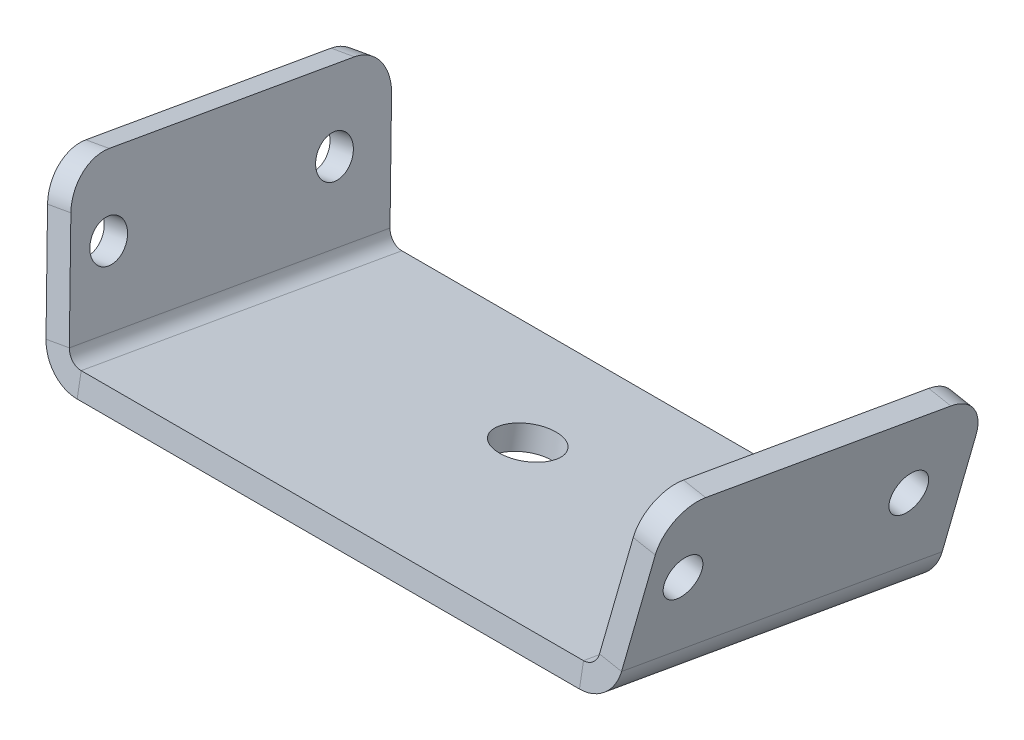
ISO-10303-21;
HEADER;
FILE_DESCRIPTION(('STEP AP214'),'2;1');
FILE_NAME('part.step','',(''),(''),'','','');
FILE_SCHEMA(('AUTOMOTIVE_DESIGN { 1 0 10303 214 1 1 1 1 }'));
ENDSEC;
DATA;
#1=APPLICATION_CONTEXT('core data for automotive mechanical design processes');
#2=APPLICATION_PROTOCOL_DEFINITION('international standard','automotive_design',2000,#1);
#3=PRODUCT_CONTEXT('',#1,'mechanical');
#4=PRODUCT('Part','Part','',(#3));
#5=PRODUCT_RELATED_PRODUCT_CATEGORY('part','',(#4));
#6=PRODUCT_DEFINITION_FORMATION('','',#4);
#7=PRODUCT_DEFINITION_CONTEXT('part definition',#1,'design');
#8=PRODUCT_DEFINITION('design','',#6,#7);
#9=PRODUCT_DEFINITION_SHAPE('','',#8);
#10=(LENGTH_UNIT() NAMED_UNIT(*) SI_UNIT(.MILLI.,.METRE.));
#11=(NAMED_UNIT(*) PLANE_ANGLE_UNIT() SI_UNIT($,.RADIAN.));
#12=(NAMED_UNIT(*) SI_UNIT($,.STERADIAN.) SOLID_ANGLE_UNIT());
#13=UNCERTAINTY_MEASURE_WITH_UNIT(LENGTH_MEASURE(1.E-05),#10,'distance_accuracy_value','');
#14=(GEOMETRIC_REPRESENTATION_CONTEXT(3) GLOBAL_UNCERTAINTY_ASSIGNED_CONTEXT((#13)) GLOBAL_UNIT_ASSIGNED_CONTEXT((#10,
#11,#12)) REPRESENTATION_CONTEXT('',''));
#15=CARTESIAN_POINT('',(0.,0.,0.));
#16=DIRECTION('',(0.,0.,1.));
#17=DIRECTION('',(1.,0.,0.));
#18=AXIS2_PLACEMENT_3D('',#15,#16,#17);
#19=CARTESIAN_POINT('',(-14.7548029468255,-94.0997079400421,29.7804315776687));
#20=DIRECTION('',(0.,-0.17364817766692,-0.98480775301221));
#21=DIRECTION('',(0.,0.98480775301221,-0.17364817766692));
#22=AXIS2_PLACEMENT_3D('',#19,#20,#21);
#23=PLANE('',#22);
#24=DIRECTION('',(0.,-0.98480775301221,0.173648177666918));
#25=VECTOR('',#24,1.);
#26=CARTESIAN_POINT('',(-13.1107289629675,-94.0997079400421,29.7804315776687));
#27=LINE('',#26,#25);
#28=CARTESIAN_POINT('',(-13.1107289629675,-94.0997079400421,29.7804315776687));
#29=VERTEX_POINT('',#28);
#30=CARTESIAN_POINT('',(-13.1107289629675,-95.2814772436567,29.988809390869));
#31=VERTEX_POINT('',#30);
#32=EDGE_CURVE('E349',#29,#31,#27,.T.);
#33=ORIENTED_EDGE('',*,*,#32,.T.);
#34=DIRECTION('',(1.,0.,0.));
#35=VECTOR('',#34,1.);
#36=CARTESIAN_POINT('',(-14.7548029468255,-95.2814772436567,29.988809390869));
#37=LINE('',#36,#35);
#38=CARTESIAN_POINT('',(13.1107289629675,-95.2814772436567,29.988809390869));
#39=VERTEX_POINT('',#38);
#40=EDGE_CURVE('E406',#31,#39,#37,.T.);
#41=ORIENTED_EDGE('',*,*,#40,.T.);
#42=DIRECTION('',(0.,-0.98480775301221,0.173648177666917));
#43=VECTOR('',#42,1.);
#44=CARTESIAN_POINT('',(13.1107289629675,-94.0997079400421,29.7804315776687));
#45=LINE('',#44,#43);
#46=CARTESIAN_POINT('',(13.1107289629675,-94.0997079400421,29.7804315776687));
#47=VERTEX_POINT('',#46);
#48=EDGE_CURVE('E403',#47,#39,#45,.T.);
#49=ORIENTED_EDGE('',*,*,#48,.F.);
#50=DIRECTION('',(1.,0.,0.));
#51=VECTOR('',#50,1.);
#52=CARTESIAN_POINT('',(-14.7548029468255,-94.0997079400421,29.7804315776687));
#53=LINE('',#52,#51);
#54=EDGE_CURVE('E408',#29,#47,#53,.T.);
#55=ORIENTED_EDGE('',*,*,#54,.F.);
#56=EDGE_LOOP('',(#33,#41,#49,#55));
#57=FACE_BOUND('',#56,.T.);
#58=ADVANCED_FACE('F177',(#57),#23,.F.);
#59=CARTESIAN_POINT('',(-14.7548029468255,-97.0517269603797,13.0386997764611));
#60=DIRECTION('',(0.,0.17364817766692,0.98480775301221));
#61=DIRECTION('',(0.,-0.98480775301221,0.17364817766692));
#62=AXIS2_PLACEMENT_3D('',#59,#60,#61);
#63=PLANE('',#62);
#64=DIRECTION('',(0.,-0.984807753012209,0.173648177666924));
#65=VECTOR('',#64,1.);
#66=CARTESIAN_POINT('',(-13.1107289629675,-97.0517269603797,13.0386997764611));
#67=LINE('',#66,#65);
#68=CARTESIAN_POINT('',(-13.1107289629675,-97.0517269603797,13.0386997764611));
#69=VERTEX_POINT('',#68);
#70=CARTESIAN_POINT('',(-13.1107289629675,-98.2334962639943,13.2470775896614));
#71=VERTEX_POINT('',#70);
#72=EDGE_CURVE('E357',#69,#71,#67,.T.);
#73=ORIENTED_EDGE('',*,*,#72,.F.);
#74=DIRECTION('',(-1.,0.,0.));
#75=VECTOR('',#74,1.);
#76=CARTESIAN_POINT('',(-14.7548029468255,-97.0517269603797,13.0386997764611));
#77=LINE('',#76,#75);
#78=CARTESIAN_POINT('',(13.1107289629675,-97.0517269603797,13.0386997764611));
#79=VERTEX_POINT('',#78);
#80=EDGE_CURVE('E410',#79,#69,#77,.T.);
#81=ORIENTED_EDGE('',*,*,#80,.F.);
#82=DIRECTION('',(0.,-0.98480775301221,0.173648177666917));
#83=VECTOR('',#82,1.);
#84=CARTESIAN_POINT('',(13.1107289629675,-97.0517269603797,13.0386997764611));
#85=LINE('',#84,#83);
#86=CARTESIAN_POINT('',(13.1107289629675,-98.2334962639943,13.2470775896614));
#87=VERTEX_POINT('',#86);
#88=EDGE_CURVE('E392',#79,#87,#85,.T.);
#89=ORIENTED_EDGE('',*,*,#88,.T.);
#90=DIRECTION('',(-1.,0.,0.));
#91=VECTOR('',#90,1.);
#92=CARTESIAN_POINT('',(-14.7548029468255,-98.2334962639943,13.2470775896614));
#93=LINE('',#92,#91);
#94=EDGE_CURVE('E411',#87,#71,#93,.T.);
#95=ORIENTED_EDGE('',*,*,#94,.T.);
#96=EDGE_LOOP('',(#73,#81,#89,#95));
#97=FACE_BOUND('',#96,.T.);
#98=ADVANCED_FACE('F490',(#97),#63,.F.);
#99=CARTESIAN_POINT('',(0.,-96.3550082929517,16.9899876884343));
#100=DIRECTION('',(0.,0.98480775301221,-0.173648177666921));
#101=DIRECTION('',(0.,0.173648177666921,0.98480775301221));
#102=AXIS2_PLACEMENT_3D('',#99,#100,#101);
#103=PLANE('',#102);
#104=CARTESIAN_POINT('',(0.,-95.8987030606714,19.5778232564622));
#105=DIRECTION('',(0.,0.98480775301221,-0.173648177666921));
#106=DIRECTION('',(0.,0.173648177666921,0.98480775301221));
#107=AXIS2_PLACEMENT_3D('',#104,#105,#106);
#108=CIRCLE('',#107,1.5);
#109=CARTESIAN_POINT('',(0.,-95.638230794171,21.0550348859805));
#110=VERTEX_POINT('',#109);
#111=EDGE_CURVE('E850',#110,#110,#108,.T.);
#112=ORIENTED_EDGE('',*,*,#111,.F.);
#113=EDGE_LOOP('',(#112));
#114=FACE_BOUND('',#113,.T.);
#115=ORIENTED_EDGE('',*,*,#80,.T.);
#116=DIRECTION('',(0.,0.173648177666918,0.98480775301221));
#117=VECTOR('',#116,1.);
#118=CARTESIAN_POINT('',(-13.1107289629675,-94.0997079400421,29.7804315776687));
#119=LINE('',#118,#117);
#120=EDGE_CURVE('E353',#29,#69,#119,.F.);
#121=ORIENTED_EDGE('',*,*,#120,.F.);
#122=ORIENTED_EDGE('',*,*,#54,.T.);
#123=DIRECTION('',(0.,-0.173648177666917,-0.98480775301221));
#124=VECTOR('',#123,1.);
#125=CARTESIAN_POINT('',(13.1107289629675,-97.0517269603797,13.0386997764611));
#126=LINE('',#125,#124);
#127=EDGE_CURVE('E398',#79,#47,#126,.F.);
#128=ORIENTED_EDGE('',*,*,#127,.F.);
#129=EDGE_LOOP('',(#115,#121,#122,#128));
#130=FACE_BOUND('',#129,.T.);
#131=ADVANCED_FACE('F488',(#114,#130),#103,.T.);
#132=CARTESIAN_POINT('',(0.,-97.5367775965663,17.1983655016346));
#133=DIRECTION('',(0.,0.98480775301221,-0.173648177666921));
#134=DIRECTION('',(0.,0.173648177666921,0.98480775301221));
#135=AXIS2_PLACEMENT_3D('',#132,#133,#134);
#136=PLANE('',#135);
#137=CARTESIAN_POINT('',(0.,-97.0804723642861,19.7862010696625));
#138=DIRECTION('',(0.,-0.98480775301221,0.17364817766692));
#139=DIRECTION('',(0.,-0.17364817766692,-0.98480775301221));
#140=AXIS2_PLACEMENT_3D('',#137,#138,#139);
#141=CIRCLE('',#140,1.5);
#142=CARTESIAN_POINT('',(0.,-97.3409446307864,18.3089894401442));
#143=VERTEX_POINT('',#142);
#144=EDGE_CURVE('E853',#143,#143,#141,.T.);
#145=ORIENTED_EDGE('',*,*,#144,.F.);
#146=EDGE_LOOP('',(#145));
#147=FACE_BOUND('',#146,.T.);
#148=DIRECTION('',(0.,0.173648177666918,0.98480775301221));
#149=VECTOR('',#148,1.);
#150=CARTESIAN_POINT('',(-13.1107289629675,-95.2814772436567,29.988809390869));
#151=LINE('',#150,#149);
#152=EDGE_CURVE('E300',#31,#71,#151,.F.);
#153=ORIENTED_EDGE('',*,*,#152,.T.);
#154=ORIENTED_EDGE('',*,*,#94,.F.);
#155=DIRECTION('',(0.,-0.173648177666917,-0.98480775301221));
#156=VECTOR('',#155,1.);
#157=CARTESIAN_POINT('',(13.1107289629675,-98.2334962639943,13.2470775896614));
#158=LINE('',#157,#156);
#159=EDGE_CURVE('E385',#87,#39,#158,.F.);
#160=ORIENTED_EDGE('',*,*,#159,.T.);
#161=ORIENTED_EDGE('',*,*,#40,.F.);
#162=EDGE_LOOP('',(#153,#154,#160,#161));
#163=FACE_BOUND('',#162,.T.);
#164=ADVANCED_FACE('F672',(#147,#163),#136,.F.);
#165=CARTESIAN_POINT('',(13.1107289629675,-93.3742985491733,29.6525223299992));
#166=DIRECTION('',(0.,0.173648177666917,0.98480775301221));
#167=DIRECTION('',(0.,-0.98480775301221,0.173648177666917));
#168=AXIS2_PLACEMENT_3D('',#165,#166,#167);
#169=PLANE('',#168);
#170=DIRECTION('',(-0.987688340595137,0.154057874009941,-0.0271645597785363));
#171=VECTOR('',#170,1.);
#172=CARTESIAN_POINT('',(15.0234862033641,-93.6726470279809,29.7051292164663));
#173=LINE('',#172,#171);
#174=CARTESIAN_POINT('',(13.8382601946499,-93.487777579169,29.6725317447321));
#175=VERTEX_POINT('',#174);
#176=CARTESIAN_POINT('',(15.0234862033641,-93.6726470279809,29.7051292164663));
#177=VERTEX_POINT('',#176);
#178=EDGE_CURVE('E360',#175,#177,#173,.F.);
#179=ORIENTED_EDGE('',*,*,#178,.F.);
#180=CARTESIAN_POINT('',(13.1107289629675,-93.3742985491733,29.6525223299992));
#181=DIRECTION('',(0.,-0.173648177666917,-0.98480775301221));
#182=DIRECTION('',(0.,0.98480775301221,-0.173648177666917));
#183=AXIS2_PLACEMENT_3D('',#180,#181,#182);
#184=CIRCLE('',#183,0.736599999999994);
#185=EDGE_CURVE('E395',#47,#175,#184,.F.);
#186=ORIENTED_EDGE('',*,*,#185,.F.);
#187=ORIENTED_EDGE('',*,*,#48,.T.);
#188=CARTESIAN_POINT('',(13.1107289629675,-93.3742985491733,29.6525223299992));
#189=DIRECTION('',(0.,-0.173648177666917,-0.98480775301221));
#190=DIRECTION('',(0.,0.98480775301221,-0.173648177666917));
#191=AXIS2_PLACEMENT_3D('',#188,#189,#190);
#192=CIRCLE('',#191,1.93659999999999);
#193=EDGE_CURVE('E388',#39,#177,#192,.F.);
#194=ORIENTED_EDGE('',*,*,#193,.T.);
#195=EDGE_LOOP('',(#179,#186,#187,#194));
#196=FACE_BOUND('',#195,.T.);
#197=ADVANCED_FACE('F478',(#196),#169,.T.);
#198=CARTESIAN_POINT('',(13.1107289629675,-96.3263175695109,12.9107905287917));
#199=DIRECTION('',(0.,0.173648177666917,0.98480775301221));
#200=DIRECTION('',(0.,-0.98480775301221,0.173648177666917));
#201=AXIS2_PLACEMENT_3D('',#198,#199,#200);
#202=PLANE('',#201);
#203=CARTESIAN_POINT('',(13.1107289629675,-96.3263175695109,12.9107905287917));
#204=DIRECTION('',(0.,-0.173648177666917,-0.98480775301221));
#205=DIRECTION('',(0.,0.98480775301221,-0.173648177666917));
#206=AXIS2_PLACEMENT_3D('',#203,#204,#205);
#207=CIRCLE('',#206,0.736599999999994);
#208=CARTESIAN_POINT('',(13.8382601946499,-96.4397965995066,12.9307999435245));
#209=VERTEX_POINT('',#208);
#210=EDGE_CURVE('E364',#209,#79,#207,.T.);
#211=ORIENTED_EDGE('',*,*,#210,.F.);
#212=DIRECTION('',(-0.987688340595137,0.154057874009941,-0.0271645597785363));
#213=VECTOR('',#212,1.);
#214=CARTESIAN_POINT('',(13.8382601946499,-96.4397965995066,12.9307999435245));
#215=LINE('',#214,#213);
#216=CARTESIAN_POINT('',(15.0234862033641,-96.6246660483186,12.9633974152588));
#217=VERTEX_POINT('',#216);
#218=EDGE_CURVE('E378',#209,#217,#215,.F.);
#219=ORIENTED_EDGE('',*,*,#218,.T.);
#220=CARTESIAN_POINT('',(13.1107289629675,-96.3263175695109,12.9107905287917));
#221=DIRECTION('',(0.,-0.173648177666917,-0.98480775301221));
#222=DIRECTION('',(0.,0.98480775301221,-0.173648177666917));
#223=AXIS2_PLACEMENT_3D('',#220,#221,#222);
#224=CIRCLE('',#223,1.93659999999999);
#225=EDGE_CURVE('E389',#217,#87,#224,.T.);
#226=ORIENTED_EDGE('',*,*,#225,.T.);
#227=ORIENTED_EDGE('',*,*,#88,.F.);
#228=EDGE_LOOP('',(#211,#219,#226,#227));
#229=FACE_BOUND('',#228,.T.);
#230=ADVANCED_FACE('F471',(#229),#202,.F.);
#231=CARTESIAN_POINT('',(13.1107289629675,-96.3263175695109,12.9107905287917));
#232=DIRECTION('',(0.,-0.173648177666917,-0.98480775301221));
#233=DIRECTION('',(0.987688340595137,-0.154057874009941,0.0271645597785358));
#234=AXIS2_PLACEMENT_3D('',#231,#232,#233);
#235=CYLINDRICAL_SURFACE('',#234,1.93659999999999);
#236=ORIENTED_EDGE('',*,*,#159,.F.);
#237=ORIENTED_EDGE('',*,*,#225,.F.);
#238=DIRECTION('',(0.,-0.173648177666921,-0.98480775301221));
#239=VECTOR('',#238,1.);
#240=CARTESIAN_POINT('',(15.0234862033641,-93.6726470279809,29.7051292164663));
#241=LINE('',#240,#239);
#242=EDGE_CURVE('E375',#217,#177,#241,.F.);
#243=ORIENTED_EDGE('',*,*,#242,.T.);
#244=ORIENTED_EDGE('',*,*,#193,.F.);
#245=EDGE_LOOP('',(#236,#237,#243,#244));
#246=FACE_BOUND('',#245,.T.);
#247=ADVANCED_FACE('F476',(#246),#235,.T.);
#248=CARTESIAN_POINT('',(13.1107289629675,-96.3263175695109,12.9107905287917));
#249=DIRECTION('',(0.,-0.173648177666917,-0.98480775301221));
#250=DIRECTION('',(0.987688340595137,-0.154057874009941,0.0271645597785358));
#251=AXIS2_PLACEMENT_3D('',#248,#249,#250);
#252=CYLINDRICAL_SURFACE('',#251,0.736599999999994);
#253=ORIENTED_EDGE('',*,*,#127,.T.);
#254=ORIENTED_EDGE('',*,*,#185,.T.);
#255=DIRECTION('',(0.,-0.173648177666921,-0.98480775301221));
#256=VECTOR('',#255,1.);
#257=CARTESIAN_POINT('',(13.8382601946499,-93.487777579169,29.6725317447321));
#258=LINE('',#257,#256);
#259=EDGE_CURVE('E381',#175,#209,#258,.T.);
#260=ORIENTED_EDGE('',*,*,#259,.T.);
#261=ORIENTED_EDGE('',*,*,#210,.T.);
#262=EDGE_LOOP('',(#253,#254,#260,#261));
#263=FACE_BOUND('',#262,.T.);
#264=ADVANCED_FACE('F485',(#263),#252,.F.);
#265=CARTESIAN_POINT('',(16.176546524916,-89.4551313261688,11.6992150046177));
#266=DIRECTION('',(0.,0.173648177666921,0.98480775301221));
#267=DIRECTION('',(0.,-0.98480775301221,0.173648177666921));
#268=AXIS2_PLACEMENT_3D('',#265,#266,#267);
#269=PLANE('',#268);
#270=DIRECTION('',(-0.156434465040235,-0.972683135377855,0.17151028044721));
#271=VECTOR('',#270,1.);
#272=CARTESIAN_POINT('',(14.9913205162018,-89.2702618773569,11.6666175328834));
#273=LINE('',#272,#271);
#274=CARTESIAN_POINT('',(14.6784515861213,-91.2156281481126,12.0096380937779));
#275=VERTEX_POINT('',#274);
#276=EDGE_CURVE('E373',#209,#275,#273,.F.);
#277=ORIENTED_EDGE('',*,*,#276,.T.);
#278=DIRECTION('',(-0.987688340595137,0.154057874009941,-0.0271645597785363));
#279=VECTOR('',#278,1.);
#280=CARTESIAN_POINT('',(15.8636775948355,-91.4004975969245,12.0422355655121));
#281=LINE('',#280,#279);
#282=CARTESIAN_POINT('',(15.8636775948355,-91.4004975969245,12.0422355655121));
#283=VERTEX_POINT('',#282);
#284=EDGE_CURVE('E13',#275,#283,#281,.F.);
#285=ORIENTED_EDGE('',*,*,#284,.T.);
#286=DIRECTION('',(0.156434465040235,0.972683135377855,-0.17151028044721));
#287=VECTOR('',#286,1.);
#288=CARTESIAN_POINT('',(29.6813288724627,-5.48467102492547,-3.10704272899972));
#289=LINE('',#288,#287);
#290=EDGE_CURVE('E367',#217,#283,#289,.T.);
#291=ORIENTED_EDGE('',*,*,#290,.F.);
#292=ORIENTED_EDGE('',*,*,#218,.F.);
#293=EDGE_LOOP('',(#277,#285,#291,#292));
#294=FACE_BOUND('',#293,.T.);
#295=ADVANCED_FACE('F468',(#294),#269,.F.);
#296=CARTESIAN_POINT('',(14.9250708045941,-94.284577388854,29.8130290494029));
#297=DIRECTION('',(0.,-0.173648177666913,-0.984807753012211));
#298=DIRECTION('',(0.,0.984807753012211,-0.173648177666913));
#299=AXIS2_PLACEMENT_3D('',#296,#297,#298);
#300=PLANE('',#299);
#301=DIRECTION('',(-0.156434465040235,-0.972683135377857,0.171510280447203));
#302=VECTOR('',#301,1.);
#303=CARTESIAN_POINT('',(29.6813288724627,-2.53265200458779,13.6346890722086));
#304=LINE('',#303,#302);
#305=CARTESIAN_POINT('',(15.8636775948355,-88.4484785765869,28.7839673667197));
#306=VERTEX_POINT('',#305);
#307=EDGE_CURVE('E362',#306,#177,#304,.T.);
#308=ORIENTED_EDGE('',*,*,#307,.F.);
#309=DIRECTION('',(-0.987688340595137,0.154057874009941,-0.0271645597785363));
#310=VECTOR('',#309,1.);
#311=CARTESIAN_POINT('',(15.8636775948355,-88.4484785765869,28.7839673667197));
#312=LINE('',#311,#310);
#313=CARTESIAN_POINT('',(14.6784515861213,-88.2636091277749,28.7513698949855));
#314=VERTEX_POINT('',#313);
#315=EDGE_CURVE('E434',#306,#314,#312,.T.);
#316=ORIENTED_EDGE('',*,*,#315,.T.);
#317=DIRECTION('',(0.156434465040235,0.972683135377857,-0.171510280447203));
#318=VECTOR('',#317,1.);
#319=CARTESIAN_POINT('',(13.7398447958799,-94.0997079400421,29.7804315776687));
#320=LINE('',#319,#318);
#321=EDGE_CURVE('E369',#314,#175,#320,.F.);
#322=ORIENTED_EDGE('',*,*,#321,.T.);
#323=ORIENTED_EDGE('',*,*,#178,.T.);
#324=EDGE_LOOP('',(#308,#316,#322,#323));
#325=FACE_BOUND('',#324,.T.);
#326=ADVANCED_FACE('F454',(#325),#300,.F.);
#327=CARTESIAN_POINT('',(29.6813288724627,-4.78795235749742,0.844245182973448));
#328=DIRECTION('',(-0.987688340595137,0.154057874009941,-0.0271645597785363));
#329=DIRECTION('',(-0.154114746164631,-0.988052956584115,0.));
#330=AXIS2_PLACEMENT_3D('',#327,#328,#329);
#331=PLANE('',#330);
#332=CARTESIAN_POINT('',(15.60001636414,-92.5189541542429,15.2857294689749));
#333=DIRECTION('',(-0.987688340595137,0.154057874009941,-0.0271645597785363));
#334=DIRECTION('',(-0.154114746164631,-0.988052956584115,0.));
#335=AXIS2_PLACEMENT_3D('',#332,#333,#334);
#336=CIRCLE('',#335,1.00000000000001);
#337=CARTESIAN_POINT('',(15.4459016179754,-93.507007110827,15.2857294689749));
#338=VERTEX_POINT('',#337);
#339=EDGE_CURVE('E346',#338,#338,#336,.T.);
#340=ORIENTED_EDGE('',*,*,#339,.T.);
#341=EDGE_LOOP('',(#340));
#342=FACE_BOUND('',#341,.T.);
#343=CARTESIAN_POINT('',(15.60001636414,-90.4403854675699,27.073878272531));
#344=DIRECTION('',(-0.987688340595137,0.154057874009941,-0.0271645597785363));
#345=DIRECTION('',(-0.154114746164631,-0.988052956584115,0.));
#346=AXIS2_PLACEMENT_3D('',#343,#344,#345);
#347=CIRCLE('',#346,1.);
#348=CARTESIAN_POINT('',(15.4459016179754,-91.428438424154,27.073878272531));
#349=VERTEX_POINT('',#348);
#350=EDGE_CURVE('E829',#349,#349,#347,.T.);
#351=ORIENTED_EDGE('',*,*,#350,.T.);
#352=EDGE_LOOP('',(#351));
#353=FACE_BOUND('',#352,.T.);
#354=DIRECTION('',(0.,0.173648177666921,0.98480775301221));
#355=VECTOR('',#354,1.);
#356=CARTESIAN_POINT('',(16.176546524916,-88.7584126587407,15.6505029165909));
#357=LINE('',#356,#355);
#358=CARTESIAN_POINT('',(16.176546524916,-89.1078349708349,13.6688305106421));
#359=VERTEX_POINT('',#358);
#360=CARTESIAN_POINT('',(16.176546524916,-86.850408661165,26.4713312998009));
#361=VERTEX_POINT('',#360);
#362=EDGE_CURVE('E365',#359,#361,#357,.T.);
#363=ORIENTED_EDGE('',*,*,#362,.T.);
#364=CARTESIAN_POINT('',(15.8636775948355,-88.7957749319207,26.8143518606953));
#365=DIRECTION('',(-0.987688340595137,0.154057874009941,-0.0271645597785363));
#366=DIRECTION('',(-0.154114746164631,-0.988052956584115,0.));
#367=AXIS2_PLACEMENT_3D('',#364,#365,#366);
#368=CIRCLE('',#367,2.);
#369=EDGE_CURVE('E185',#361,#306,#368,.F.);
#370=ORIENTED_EDGE('',*,*,#369,.T.);
#371=ORIENTED_EDGE('',*,*,#307,.T.);
#372=ORIENTED_EDGE('',*,*,#242,.F.);
#373=ORIENTED_EDGE('',*,*,#290,.T.);
#374=CARTESIAN_POINT('',(15.8636775948355,-91.0532012415907,14.0118510715365));
#375=DIRECTION('',(-0.987688340595137,0.154057874009941,-0.0271645597785363));
#376=DIRECTION('',(-0.154114746164631,-0.988052956584115,0.));
#377=AXIS2_PLACEMENT_3D('',#374,#375,#376);
#378=CIRCLE('',#377,2.);
#379=EDGE_CURVE('E445',#283,#359,#378,.F.);
#380=ORIENTED_EDGE('',*,*,#379,.T.);
#381=EDGE_LOOP('',(#363,#370,#371,#372,#373,#380));
#382=FACE_BOUND('',#381,.T.);
#383=ADVANCED_FACE('F449',(#342,#353,#382),#331,.F.);
#384=CARTESIAN_POINT('',(28.4961028637485,-4.6030829086855,0.811647711239205));
#385=DIRECTION('',(-0.987688340595137,0.154057874009941,-0.0271645597785363));
#386=DIRECTION('',(-0.154114746164631,-0.988052956584115,0.));
#387=AXIS2_PLACEMENT_3D('',#384,#385,#386);
#388=PLANE('',#387);
#389=CARTESIAN_POINT('',(14.4147903554259,-92.334084705431,15.2531319972406));
#390=DIRECTION('',(-0.987688340595137,0.154057874009941,-0.0271645597785346));
#391=DIRECTION('',(-0.154114746164631,-0.988052956584115,0.));
#392=AXIS2_PLACEMENT_3D('',#389,#390,#391);
#393=CIRCLE('',#392,1.00000000000001);
#394=CARTESIAN_POINT('',(14.2606756092612,-93.3221376620151,15.2531319972406));
#395=VERTEX_POINT('',#394);
#396=EDGE_CURVE('E831',#395,#395,#393,.T.);
#397=ORIENTED_EDGE('',*,*,#396,.F.);
#398=EDGE_LOOP('',(#397));
#399=FACE_BOUND('',#398,.T.);
#400=CARTESIAN_POINT('',(14.4147903554259,-90.2555160187579,27.0412808007968));
#401=DIRECTION('',(-0.987688340595137,0.154057874009941,-0.0271645597785346));
#402=DIRECTION('',(-0.154114746164631,-0.988052956584115,0.));
#403=AXIS2_PLACEMENT_3D('',#400,#401,#402);
#404=CIRCLE('',#403,1.);
#405=CARTESIAN_POINT('',(14.2606756092613,-91.2435689753421,27.0412808007968));
#406=VERTEX_POINT('',#405);
#407=EDGE_CURVE('E826',#406,#406,#404,.T.);
#408=ORIENTED_EDGE('',*,*,#407,.F.);
#409=EDGE_LOOP('',(#408));
#410=FACE_BOUND('',#409,.T.);
#411=ORIENTED_EDGE('',*,*,#321,.F.);
#412=CARTESIAN_POINT('',(14.6784515861213,-88.6109054831088,26.781754388961));
#413=DIRECTION('',(-0.987688340595137,0.154057874009941,-0.0271645597785363));
#414=DIRECTION('',(-0.154114746164631,-0.988052956584115,0.));
#415=AXIS2_PLACEMENT_3D('',#412,#413,#414);
#416=CIRCLE('',#415,2.);
#417=CARTESIAN_POINT('',(14.9913205162018,-86.6655392123531,26.4387338280666));
#418=VERTEX_POINT('',#417);
#419=EDGE_CURVE('E439',#314,#418,#416,.T.);
#420=ORIENTED_EDGE('',*,*,#419,.T.);
#421=DIRECTION('',(0.,-0.173648177666921,-0.98480775301221));
#422=VECTOR('',#421,1.);
#423=CARTESIAN_POINT('',(14.9913205162018,-86.3182428570192,28.4083493340911));
#424=LINE('',#423,#422);
#425=CARTESIAN_POINT('',(14.9913205162018,-88.922965522023,13.6362330389078));
#426=VERTEX_POINT('',#425);
#427=EDGE_CURVE('E371',#426,#418,#424,.F.);
#428=ORIENTED_EDGE('',*,*,#427,.F.);
#429=CARTESIAN_POINT('',(14.6784515861213,-90.8683317927787,13.9792535998023));
#430=DIRECTION('',(-0.987688340595137,0.154057874009941,-0.0271645597785363));
#431=DIRECTION('',(-0.154114746164631,-0.988052956584115,0.));
#432=AXIS2_PLACEMENT_3D('',#429,#430,#431);
#433=CIRCLE('',#432,2.);
#434=EDGE_CURVE('E437',#426,#275,#433,.T.);
#435=ORIENTED_EDGE('',*,*,#434,.T.);
#436=ORIENTED_EDGE('',*,*,#276,.F.);
#437=ORIENTED_EDGE('',*,*,#259,.F.);
#438=EDGE_LOOP('',(#411,#420,#428,#435,#436,#437));
#439=FACE_BOUND('',#438,.T.);
#440=ADVANCED_FACE('F460',(#399,#410,#439),#388,.T.);
#441=CARTESIAN_POINT('',(16.176546524916,-86.5031123058311,28.4409468058253));
#442=DIRECTION('',(-0.156434465040235,-0.972683135377855,0.17151028044721));
#443=DIRECTION('',(0.,-0.173648177666921,-0.98480775301221));
#444=AXIS2_PLACEMENT_3D('',#441,#442,#443);
#445=PLANE('',#444);
#446=ORIENTED_EDGE('',*,*,#427,.T.);
#447=DIRECTION('',(-0.987688340595137,0.15405787400994,-0.0271645597785363));
#448=VECTOR('',#447,1.);
#449=CARTESIAN_POINT('',(16.176546524916,-86.850408661165,26.4713312998009));
#450=LINE('',#449,#448);
#451=EDGE_CURVE('E198',#418,#361,#450,.F.);
#452=ORIENTED_EDGE('',*,*,#451,.T.);
#453=ORIENTED_EDGE('',*,*,#362,.F.);
#454=DIRECTION('',(-0.987688340595137,0.15405787400994,-0.0271645597785363));
#455=VECTOR('',#454,1.);
#456=CARTESIAN_POINT('',(16.176546524916,-89.107834970835,13.6688305106421));
#457=LINE('',#456,#455);
#458=EDGE_CURVE('E441',#359,#426,#457,.T.);
#459=ORIENTED_EDGE('',*,*,#458,.T.);
#460=EDGE_LOOP('',(#446,#452,#453,#459));
#461=FACE_BOUND('',#460,.T.);
#462=ADVANCED_FACE('F462',(#461),#445,.F.);
#463=CARTESIAN_POINT('',(-13.1107289629675,-96.3263175695109,12.9107905287917));
#464=DIRECTION('',(0.,-0.173648177666918,-0.98480775301221));
#465=DIRECTION('',(0.,0.98480775301221,-0.173648177666918));
#466=AXIS2_PLACEMENT_3D('',#463,#464,#465);
#467=PLANE('',#466);
#468=DIRECTION('',(0.987688340595137,0.154057874009941,-0.0271645597785353));
#469=VECTOR('',#468,1.);
#470=CARTESIAN_POINT('',(-15.023486203364,-96.6246660483186,12.9633974152588));
#471=LINE('',#470,#469);
#472=CARTESIAN_POINT('',(-13.8382601946499,-96.4397965995066,12.9307999435245));
#473=VERTEX_POINT('',#472);
#474=CARTESIAN_POINT('',(-15.0234862033641,-96.6246660483186,12.9633974152588));
#475=VERTEX_POINT('',#474);
#476=EDGE_CURVE('E343',#473,#475,#471,.F.);
#477=ORIENTED_EDGE('',*,*,#476,.F.);
#478=CARTESIAN_POINT('',(-13.1107289629675,-96.3263175695109,12.9107905287917));
#479=DIRECTION('',(0.,0.173648177666918,0.98480775301221));
#480=DIRECTION('',(0.,-0.98480775301221,0.173648177666918));
#481=AXIS2_PLACEMENT_3D('',#478,#479,#480);
#482=CIRCLE('',#481,0.736599999999995);
#483=EDGE_CURVE('E303',#69,#473,#482,.F.);
#484=ORIENTED_EDGE('',*,*,#483,.F.);
#485=ORIENTED_EDGE('',*,*,#72,.T.);
#486=CARTESIAN_POINT('',(-13.1107289629675,-96.3263175695109,12.9107905287916));
#487=DIRECTION('',(0.,0.173648177666918,0.98480775301221));
#488=DIRECTION('',(0.,-0.98480775301221,0.173648177666918));
#489=AXIS2_PLACEMENT_3D('',#486,#487,#488);
#490=CIRCLE('',#489,1.9366);
#491=EDGE_CURVE('E348',#71,#475,#490,.F.);
#492=ORIENTED_EDGE('',*,*,#491,.T.);
#493=EDGE_LOOP('',(#477,#484,#485,#492));
#494=FACE_BOUND('',#493,.T.);
#495=ADVANCED_FACE('F495',(#494),#467,.T.);
#496=CARTESIAN_POINT('',(-13.1107289629675,-93.3742985491733,29.6525223299992));
#497=DIRECTION('',(0.,-0.173648177666918,-0.98480775301221));
#498=DIRECTION('',(0.,0.98480775301221,-0.173648177666918));
#499=AXIS2_PLACEMENT_3D('',#496,#497,#498);
#500=PLANE('',#499);
#501=CARTESIAN_POINT('',(-13.1107289629675,-93.3742985491733,29.6525223299992));
#502=DIRECTION('',(0.,0.173648177666918,0.98480775301221));
#503=DIRECTION('',(0.,-0.98480775301221,0.173648177666918));
#504=AXIS2_PLACEMENT_3D('',#501,#502,#503);
#505=CIRCLE('',#504,0.736599999999995);
#506=CARTESIAN_POINT('',(-13.8382601946499,-93.487777579169,29.6725317447321));
#507=VERTEX_POINT('',#506);
#508=EDGE_CURVE('E310',#507,#29,#505,.T.);
#509=ORIENTED_EDGE('',*,*,#508,.F.);
#510=DIRECTION('',(0.987688340595137,0.154057874009941,-0.0271645597785353));
#511=VECTOR('',#510,1.);
#512=CARTESIAN_POINT('',(-13.8382601946499,-93.487777579169,29.6725317447321));
#513=LINE('',#512,#511);
#514=CARTESIAN_POINT('',(-15.0234862033641,-93.6726470279809,29.7051292164663));
#515=VERTEX_POINT('',#514);
#516=EDGE_CURVE('E307',#507,#515,#513,.F.);
#517=ORIENTED_EDGE('',*,*,#516,.T.);
#518=CARTESIAN_POINT('',(-13.1107289629675,-93.3742985491733,29.6525223299992));
#519=DIRECTION('',(0.,0.173648177666918,0.98480775301221));
#520=DIRECTION('',(0.,-0.98480775301221,0.173648177666918));
#521=AXIS2_PLACEMENT_3D('',#518,#519,#520);
#522=CIRCLE('',#521,1.9366);
#523=EDGE_CURVE('E293',#515,#31,#522,.T.);
#524=ORIENTED_EDGE('',*,*,#523,.T.);
#525=ORIENTED_EDGE('',*,*,#32,.F.);
#526=EDGE_LOOP('',(#509,#517,#524,#525));
#527=FACE_BOUND('',#526,.T.);
#528=ADVANCED_FACE('F308',(#527),#500,.F.);
#529=CARTESIAN_POINT('',(-13.1107289629675,-93.3742985491733,29.6525223299992));
#530=DIRECTION('',(0.,0.173648177666918,0.98480775301221));
#531=DIRECTION('',(-0.987688340595137,-0.15405787400994,0.0271645597785358));
#532=AXIS2_PLACEMENT_3D('',#529,#530,#531);
#533=CYLINDRICAL_SURFACE('',#532,1.9366);
#534=ORIENTED_EDGE('',*,*,#152,.F.);
#535=ORIENTED_EDGE('',*,*,#523,.F.);
#536=DIRECTION('',(0.,0.173648177666922,0.98480775301221));
#537=VECTOR('',#536,1.);
#538=CARTESIAN_POINT('',(-15.0234862033641,-96.6246660483186,12.9633974152588));
#539=LINE('',#538,#537);
#540=EDGE_CURVE('E298',#515,#475,#539,.F.);
#541=ORIENTED_EDGE('',*,*,#540,.T.);
#542=ORIENTED_EDGE('',*,*,#491,.F.);
#543=EDGE_LOOP('',(#534,#535,#541,#542));
#544=FACE_BOUND('',#543,.T.);
#545=ADVANCED_FACE('F295',(#544),#533,.T.);
#546=CARTESIAN_POINT('',(-13.1107289629675,-93.3742985491733,29.6525223299992));
#547=DIRECTION('',(0.,0.173648177666918,0.98480775301221));
#548=DIRECTION('',(-0.987688340595137,-0.15405787400994,0.0271645597785358));
#549=AXIS2_PLACEMENT_3D('',#546,#547,#548);
#550=CYLINDRICAL_SURFACE('',#549,0.736599999999995);
#551=ORIENTED_EDGE('',*,*,#120,.T.);
#552=ORIENTED_EDGE('',*,*,#483,.T.);
#553=DIRECTION('',(0.,0.173648177666922,0.98480775301221));
#554=VECTOR('',#553,1.);
#555=CARTESIAN_POINT('',(-13.8382601946499,-96.4397965995067,12.9307999435245));
#556=LINE('',#555,#554);
#557=EDGE_CURVE('E315',#473,#507,#556,.T.);
#558=ORIENTED_EDGE('',*,*,#557,.T.);
#559=ORIENTED_EDGE('',*,*,#508,.T.);
#560=EDGE_LOOP('',(#551,#552,#558,#559));
#561=FACE_BOUND('',#560,.T.);
#562=ADVANCED_FACE('F498',(#561),#550,.F.);
#563=CARTESIAN_POINT('',(-14.9250708045941,-97.2365964091916,13.0712972481954));
#564=DIRECTION('',(0.,0.17364817766692,0.98480775301221));
#565=DIRECTION('',(0.,-0.98480775301221,0.17364817766692));
#566=AXIS2_PLACEMENT_3D('',#563,#564,#565);
#567=PLANE('',#566);
#568=DIRECTION('',(0.156434465040234,-0.972683135377855,0.17151028044721));
#569=VECTOR('',#568,1.);
#570=CARTESIAN_POINT('',(-29.6813288724627,-5.48467102492546,-3.10704272899973));
#571=LINE('',#570,#569);
#572=CARTESIAN_POINT('',(-15.8636775948355,-91.4004975969245,12.0422355655121));
#573=VERTEX_POINT('',#572);
#574=EDGE_CURVE('E323',#573,#475,#571,.T.);
#575=ORIENTED_EDGE('',*,*,#574,.F.);
#576=DIRECTION('',(0.987688340595137,0.154057874009941,-0.0271645597785353));
#577=VECTOR('',#576,1.);
#578=CARTESIAN_POINT('',(-15.8636775948355,-91.4004975969245,12.0422355655121));
#579=LINE('',#578,#577);
#580=CARTESIAN_POINT('',(-14.6784515861213,-91.2156281481126,12.0096380937778));
#581=VERTEX_POINT('',#580);
#582=EDGE_CURVE('E431',#573,#581,#579,.T.);
#583=ORIENTED_EDGE('',*,*,#582,.T.);
#584=DIRECTION('',(-0.156434465040234,0.972683135377855,-0.17151028044721));
#585=VECTOR('',#584,1.);
#586=CARTESIAN_POINT('',(-13.7398447958799,-97.0517269603797,13.0386997764611));
#587=LINE('',#586,#585);
#588=EDGE_CURVE('E324',#581,#473,#587,.F.);
#589=ORIENTED_EDGE('',*,*,#588,.T.);
#590=ORIENTED_EDGE('',*,*,#476,.T.);
#591=EDGE_LOOP('',(#575,#583,#589,#590));
#592=FACE_BOUND('',#591,.T.);
#593=ADVANCED_FACE('F515',(#592),#567,.F.);
#594=CARTESIAN_POINT('',(-16.176546524916,-86.5031123058312,28.4409468058253));
#595=DIRECTION('',(0.,-0.173648177666917,-0.984807753012211));
#596=DIRECTION('',(0.,0.984807753012211,-0.173648177666917));
#597=AXIS2_PLACEMENT_3D('',#594,#595,#596);
#598=PLANE('',#597);
#599=DIRECTION('',(0.156434465040234,-0.972683135377856,0.171510280447207));
#600=VECTOR('',#599,1.);
#601=CARTESIAN_POINT('',(-14.9913205162018,-86.3182428570192,28.408349334091));
#602=LINE('',#601,#600);
#603=CARTESIAN_POINT('',(-14.6784515861213,-88.263609127775,28.7513698949854));
#604=VERTEX_POINT('',#603);
#605=EDGE_CURVE('E339',#507,#604,#602,.F.);
#606=ORIENTED_EDGE('',*,*,#605,.T.);
#607=DIRECTION('',(0.987688340595137,0.154057874009941,-0.0271645597785353));
#608=VECTOR('',#607,1.);
#609=CARTESIAN_POINT('',(-15.8636775948355,-88.4484785765869,28.7839673667197));
#610=LINE('',#609,#608);
#611=CARTESIAN_POINT('',(-15.8636775948355,-88.4484785765869,28.7839673667197));
#612=VERTEX_POINT('',#611);
#613=EDGE_CURVE('E328',#604,#612,#610,.F.);
#614=ORIENTED_EDGE('',*,*,#613,.T.);
#615=DIRECTION('',(-0.156434465040234,0.972683135377856,-0.171510280447207));
#616=VECTOR('',#615,1.);
#617=CARTESIAN_POINT('',(-29.6813288724627,-2.5326520045878,13.6346890722082));
#618=LINE('',#617,#616);
#619=EDGE_CURVE('E320',#515,#612,#618,.T.);
#620=ORIENTED_EDGE('',*,*,#619,.F.);
#621=ORIENTED_EDGE('',*,*,#516,.F.);
#622=EDGE_LOOP('',(#606,#614,#620,#621));
#623=FACE_BOUND('',#622,.T.);
#624=ADVANCED_FACE('F326',(#623),#598,.F.);
#625=CARTESIAN_POINT('',(-29.6813288724627,-4.78795235749742,0.844245182973419));
#626=DIRECTION('',(0.987688340595137,0.154057874009941,-0.0271645597785354));
#627=DIRECTION('',(-0.154114746164631,0.988052956584115,0.));
#628=AXIS2_PLACEMENT_3D('',#625,#626,#627);
#629=PLANE('',#628);
#630=CARTESIAN_POINT('',(-15.60001636414,-90.4403854675699,27.073878272531));
#631=DIRECTION('',(-0.987688340595137,-0.154057874009941,0.0271645597785363));
#632=DIRECTION('',(0.154114746164631,-0.988052956584115,0.));
#633=AXIS2_PLACEMENT_3D('',#630,#631,#632);
#634=CIRCLE('',#633,1.);
#635=CARTESIAN_POINT('',(-15.4459016179754,-91.428438424154,27.073878272531));
#636=VERTEX_POINT('',#635);
#637=EDGE_CURVE('E844',#636,#636,#634,.T.);
#638=ORIENTED_EDGE('',*,*,#637,.F.);
#639=EDGE_LOOP('',(#638));
#640=FACE_BOUND('',#639,.T.);
#641=CARTESIAN_POINT('',(-15.60001636414,-92.5189541542429,15.2857294689749));
#642=DIRECTION('',(-0.987688340595137,-0.154057874009941,0.0271645597785363));
#643=DIRECTION('',(0.154114746164631,-0.988052956584115,0.));
#644=AXIS2_PLACEMENT_3D('',#641,#642,#643);
#645=CIRCLE('',#644,1.00000000000001);
#646=CARTESIAN_POINT('',(-15.4459016179754,-93.507007110827,15.2857294689749));
#647=VERTEX_POINT('',#646);
#648=EDGE_CURVE('E837',#647,#647,#645,.T.);
#649=ORIENTED_EDGE('',*,*,#648,.F.);
#650=EDGE_LOOP('',(#649));
#651=FACE_BOUND('',#650,.T.);
#652=ORIENTED_EDGE('',*,*,#619,.T.);
#653=CARTESIAN_POINT('',(-15.8636775948355,-88.7957749319207,26.8143518606953));
#654=DIRECTION('',(0.987688340595137,0.154057874009941,-0.0271645597785354));
#655=DIRECTION('',(-0.154114746164631,0.988052956584115,0.));
#656=AXIS2_PLACEMENT_3D('',#653,#654,#655);
#657=CIRCLE('',#656,2.);
#658=CARTESIAN_POINT('',(-16.176546524916,-86.850408661165,26.4713312998008));
#659=VERTEX_POINT('',#658);
#660=EDGE_CURVE('E429',#612,#659,#657,.F.);
#661=ORIENTED_EDGE('',*,*,#660,.T.);
#662=DIRECTION('',(0.,-0.173648177666921,-0.98480775301221));
#663=VECTOR('',#662,1.);
#664=CARTESIAN_POINT('',(-16.1765465249159,-88.7584126587408,15.6505029165909));
#665=LINE('',#664,#663);
#666=CARTESIAN_POINT('',(-16.1765465249159,-89.107834970835,13.6688305106421));
#667=VERTEX_POINT('',#666);
#668=EDGE_CURVE('E329',#659,#667,#665,.T.);
#669=ORIENTED_EDGE('',*,*,#668,.T.);
#670=CARTESIAN_POINT('',(-15.8636775948355,-91.0532012415907,14.0118510715365));
#671=DIRECTION('',(0.987688340595137,0.154057874009941,-0.0271645597785354));
#672=DIRECTION('',(-0.154114746164631,0.988052956584115,0.));
#673=AXIS2_PLACEMENT_3D('',#670,#671,#672);
#674=CIRCLE('',#673,2.);
#675=EDGE_CURVE('E427',#667,#573,#674,.F.);
#676=ORIENTED_EDGE('',*,*,#675,.T.);
#677=ORIENTED_EDGE('',*,*,#574,.T.);
#678=ORIENTED_EDGE('',*,*,#540,.F.);
#679=EDGE_LOOP('',(#652,#661,#669,#676,#677,#678));
#680=FACE_BOUND('',#679,.T.);
#681=ADVANCED_FACE('F319',(#640,#651,#680),#629,.F.);
#682=CARTESIAN_POINT('',(-28.4961028637485,-4.60308290868549,0.811647711239177));
#683=DIRECTION('',(0.987688340595137,0.154057874009941,-0.0271645597785354));
#684=DIRECTION('',(-0.154114746164631,0.988052956584115,0.));
#685=AXIS2_PLACEMENT_3D('',#682,#683,#684);
#686=PLANE('',#685);
#687=CARTESIAN_POINT('',(-14.4147903554259,-90.2555160187579,27.0412808007968));
#688=DIRECTION('',(-0.987688340595137,-0.154057874009941,0.0271645597785346));
#689=DIRECTION('',(0.154114746164631,-0.988052956584115,0.));
#690=AXIS2_PLACEMENT_3D('',#687,#688,#689);
#691=CIRCLE('',#690,1.);
#692=CARTESIAN_POINT('',(-14.2606756092613,-91.2435689753421,27.0412808007968));
#693=VERTEX_POINT('',#692);
#694=EDGE_CURVE('E847',#693,#693,#691,.T.);
#695=ORIENTED_EDGE('',*,*,#694,.T.);
#696=EDGE_LOOP('',(#695));
#697=FACE_BOUND('',#696,.T.);
#698=CARTESIAN_POINT('',(-14.4147903554259,-92.334084705431,15.2531319972406));
#699=DIRECTION('',(-0.987688340595137,-0.154057874009941,0.0271645597785346));
#700=DIRECTION('',(0.154114746164631,-0.988052956584115,0.));
#701=AXIS2_PLACEMENT_3D('',#698,#699,#700);
#702=CIRCLE('',#701,1.00000000000001);
#703=CARTESIAN_POINT('',(-14.2606756092612,-93.3221376620151,15.2531319972406));
#704=VERTEX_POINT('',#703);
#705=EDGE_CURVE('E841',#704,#704,#702,.T.);
#706=ORIENTED_EDGE('',*,*,#705,.T.);
#707=EDGE_LOOP('',(#706));
#708=FACE_BOUND('',#707,.T.);
#709=DIRECTION('',(0.,0.173648177666921,0.98480775301221));
#710=VECTOR('',#709,1.);
#711=CARTESIAN_POINT('',(-14.9913205162018,-89.2702618773569,11.6666175328834));
#712=LINE('',#711,#710);
#713=CARTESIAN_POINT('',(-14.9913205162018,-86.6655392123531,26.4387338280666));
#714=VERTEX_POINT('',#713);
#715=CARTESIAN_POINT('',(-14.9913205162018,-88.922965522023,13.6362330389078));
#716=VERTEX_POINT('',#715);
#717=EDGE_CURVE('E333',#714,#716,#712,.F.);
#718=ORIENTED_EDGE('',*,*,#717,.F.);
#719=CARTESIAN_POINT('',(-14.6784515861213,-88.6109054831088,26.781754388961));
#720=DIRECTION('',(0.987688340595137,0.154057874009941,-0.0271645597785354));
#721=DIRECTION('',(-0.154114746164631,0.988052956584115,0.));
#722=AXIS2_PLACEMENT_3D('',#719,#720,#721);
#723=CIRCLE('',#722,2.);
#724=EDGE_CURVE('E424',#714,#604,#723,.T.);
#725=ORIENTED_EDGE('',*,*,#724,.T.);
#726=ORIENTED_EDGE('',*,*,#605,.F.);
#727=ORIENTED_EDGE('',*,*,#557,.F.);
#728=ORIENTED_EDGE('',*,*,#588,.F.);
#729=CARTESIAN_POINT('',(-14.6784515861213,-90.8683317927788,13.9792535998023));
#730=DIRECTION('',(0.987688340595137,0.154057874009941,-0.0271645597785354));
#731=DIRECTION('',(-0.154114746164631,0.988052956584115,0.));
#732=AXIS2_PLACEMENT_3D('',#729,#730,#731);
#733=CIRCLE('',#732,2.);
#734=EDGE_CURVE('E422',#581,#716,#733,.T.);
#735=ORIENTED_EDGE('',*,*,#734,.T.);
#736=EDGE_LOOP('',(#718,#725,#726,#727,#728,#735));
#737=FACE_BOUND('',#736,.T.);
#738=ADVANCED_FACE('F502',(#697,#708,#737),#686,.T.);
#739=CARTESIAN_POINT('',(-16.1765465249159,-89.4551313261688,11.6992150046177));
#740=DIRECTION('',(0.156434465040235,-0.972683135377855,0.171510280447211));
#741=DIRECTION('',(0.,-0.173648177666921,-0.98480775301221));
#742=AXIS2_PLACEMENT_3D('',#739,#740,#741);
#743=PLANE('',#742);
#744=ORIENTED_EDGE('',*,*,#668,.F.);
#745=DIRECTION('',(0.987688340595137,0.154057874009941,-0.0271645597785353));
#746=VECTOR('',#745,1.);
#747=CARTESIAN_POINT('',(-16.176546524916,-86.850408661165,26.4713312998008));
#748=LINE('',#747,#746);
#749=EDGE_CURVE('E419',#659,#714,#748,.T.);
#750=ORIENTED_EDGE('',*,*,#749,.T.);
#751=ORIENTED_EDGE('',*,*,#717,.T.);
#752=DIRECTION('',(0.987688340595137,0.154057874009941,-0.0271645597785353));
#753=VECTOR('',#752,1.);
#754=CARTESIAN_POINT('',(-16.1765465249159,-89.107834970835,13.6688305106421));
#755=LINE('',#754,#753);
#756=EDGE_CURVE('E414',#716,#667,#755,.F.);
#757=ORIENTED_EDGE('',*,*,#756,.T.);
#758=EDGE_LOOP('',(#744,#750,#751,#757));
#759=FACE_BOUND('',#758,.T.);
#760=ADVANCED_FACE('F509',(#759),#743,.F.);
#761=CARTESIAN_POINT('',(35.1562455079238,-93.4907313729667,27.611736556146));
#762=DIRECTION('',(-0.987688340595137,0.154057874009941,-0.0271645597785346));
#763=DIRECTION('',(-0.154114746164631,-0.988052956584115,0.));
#764=AXIS2_PLACEMENT_3D('',#761,#762,#763);
#765=CYLINDRICAL_SURFACE('',#764,1.);
#766=ORIENTED_EDGE('',*,*,#407,.T.);
#767=EDGE_LOOP('',(#766));
#768=FACE_BOUND('',#767,.T.);
#769=ORIENTED_EDGE('',*,*,#350,.F.);
#770=EDGE_LOOP('',(#769));
#771=FACE_BOUND('',#770,.T.);
#772=ADVANCED_FACE('F570',(#768,#771),#765,.F.);
#773=CARTESIAN_POINT('',(35.1562455079237,-95.5693000596397,15.8235877525898));
#774=DIRECTION('',(-0.987688340595137,0.154057874009941,-0.0271645597785346));
#775=DIRECTION('',(-0.154114746164631,-0.988052956584115,0.));
#776=AXIS2_PLACEMENT_3D('',#773,#774,#775);
#777=CYLINDRICAL_SURFACE('',#776,1.00000000000001);
#778=ORIENTED_EDGE('',*,*,#396,.T.);
#779=EDGE_LOOP('',(#778));
#780=FACE_BOUND('',#779,.T.);
#781=ORIENTED_EDGE('',*,*,#339,.F.);
#782=EDGE_LOOP('',(#781));
#783=FACE_BOUND('',#782,.T.);
#784=ADVANCED_FACE('F706',(#780,#783),#777,.F.);
#785=CARTESIAN_POINT('',(-35.1562455079237,-95.5693000596397,15.8235877525898));
#786=DIRECTION('',(0.987688340595137,0.154057874009941,-0.0271645597785346));
#787=DIRECTION('',(0.154114746164631,-0.988052956584115,0.));
#788=AXIS2_PLACEMENT_3D('',#785,#786,#787);
#789=CYLINDRICAL_SURFACE('',#788,1.00000000000001);
#790=ORIENTED_EDGE('',*,*,#705,.F.);
#791=EDGE_LOOP('',(#790));
#792=FACE_BOUND('',#791,.T.);
#793=ORIENTED_EDGE('',*,*,#648,.T.);
#794=EDGE_LOOP('',(#793));
#795=FACE_BOUND('',#794,.T.);
#796=ADVANCED_FACE('F696',(#792,#795),#789,.F.);
#797=CARTESIAN_POINT('',(-35.1562455079238,-93.4907313729667,27.611736556146));
#798=DIRECTION('',(0.987688340595137,0.154057874009941,-0.0271645597785346));
#799=DIRECTION('',(0.154114746164631,-0.988052956584115,0.));
#800=AXIS2_PLACEMENT_3D('',#797,#798,#799);
#801=CYLINDRICAL_SURFACE('',#800,1.);
#802=ORIENTED_EDGE('',*,*,#694,.F.);
#803=EDGE_LOOP('',(#802));
#804=FACE_BOUND('',#803,.T.);
#805=ORIENTED_EDGE('',*,*,#637,.T.);
#806=EDGE_LOOP('',(#805));
#807=FACE_BOUND('',#806,.T.);
#808=ADVANCED_FACE('F664',(#804,#807),#801,.F.);
#809=CARTESIAN_POINT('',(0.,-87.232394834164,18.0497192929933));
#810=DIRECTION('',(0.,-0.98480775301221,0.17364817766692));
#811=DIRECTION('',(0.,-0.17364817766692,-0.98480775301221));
#812=AXIS2_PLACEMENT_3D('',#809,#810,#811);
#813=CYLINDRICAL_SURFACE('',#812,1.5);
#814=ORIENTED_EDGE('',*,*,#111,.T.);
#815=EDGE_LOOP('',(#814));
#816=FACE_BOUND('',#815,.T.);
#817=ORIENTED_EDGE('',*,*,#144,.T.);
#818=EDGE_LOOP('',(#817));
#819=FACE_BOUND('',#818,.T.);
#820=ADVANCED_FACE('F535',(#816,#819),#813,.F.);
#821=CARTESIAN_POINT('',(-15.8636775948355,-88.7957749319207,26.8143518606953));
#822=DIRECTION('',(0.987688340595137,0.154057874009941,-0.0271645597785353));
#823=DIRECTION('',(-0.154114746164631,0.988052956584115,0.));
#824=AXIS2_PLACEMENT_3D('',#821,#822,#823);
#825=CYLINDRICAL_SURFACE('',#824,2.);
#826=ORIENTED_EDGE('',*,*,#660,.F.);
#827=ORIENTED_EDGE('',*,*,#613,.F.);
#828=ORIENTED_EDGE('',*,*,#724,.F.);
#829=ORIENTED_EDGE('',*,*,#749,.F.);
#830=EDGE_LOOP('',(#826,#827,#828,#829));
#831=FACE_BOUND('',#830,.T.);
#832=ADVANCED_FACE('F504',(#831),#825,.T.);
#833=CARTESIAN_POINT('',(-15.8636775948355,-91.0532012415907,14.0118510715365));
#834=DIRECTION('',(0.987688340595137,0.154057874009941,-0.0271645597785353));
#835=DIRECTION('',(-0.154114746164631,0.988052956584115,0.));
#836=AXIS2_PLACEMENT_3D('',#833,#834,#835);
#837=CYLINDRICAL_SURFACE('',#836,2.);
#838=ORIENTED_EDGE('',*,*,#675,.F.);
#839=ORIENTED_EDGE('',*,*,#756,.F.);
#840=ORIENTED_EDGE('',*,*,#734,.F.);
#841=ORIENTED_EDGE('',*,*,#582,.F.);
#842=EDGE_LOOP('',(#838,#839,#840,#841));
#843=FACE_BOUND('',#842,.T.);
#844=ADVANCED_FACE('F512',(#843),#837,.T.);
#845=CARTESIAN_POINT('',(15.8636775948355,-88.7957749319207,26.8143518606953));
#846=DIRECTION('',(-0.987688340595137,0.15405787400994,-0.0271645597785363));
#847=DIRECTION('',(-0.154114746164631,-0.988052956584115,0.));
#848=AXIS2_PLACEMENT_3D('',#845,#846,#847);
#849=CYLINDRICAL_SURFACE('',#848,2.);
#850=ORIENTED_EDGE('',*,*,#369,.F.);
#851=ORIENTED_EDGE('',*,*,#451,.F.);
#852=ORIENTED_EDGE('',*,*,#419,.F.);
#853=ORIENTED_EDGE('',*,*,#315,.F.);
#854=EDGE_LOOP('',(#850,#851,#852,#853));
#855=FACE_BOUND('',#854,.T.);
#856=ADVANCED_FACE('F457',(#855),#849,.T.);
#857=CARTESIAN_POINT('',(15.8636775948355,-91.0532012415907,14.0118510715365));
#858=DIRECTION('',(-0.987688340595137,0.15405787400994,-0.0271645597785363));
#859=DIRECTION('',(-0.154114746164631,-0.988052956584115,0.));
#860=AXIS2_PLACEMENT_3D('',#857,#858,#859);
#861=CYLINDRICAL_SURFACE('',#860,2.);
#862=ORIENTED_EDGE('',*,*,#379,.F.);
#863=ORIENTED_EDGE('',*,*,#284,.F.);
#864=ORIENTED_EDGE('',*,*,#434,.F.);
#865=ORIENTED_EDGE('',*,*,#458,.F.);
#866=EDGE_LOOP('',(#862,#863,#864,#865));
#867=FACE_BOUND('',#866,.T.);
#868=ADVANCED_FACE('F179',(#867),#861,.T.);
#869=CLOSED_SHELL('',(#58,#98,#131,#164,#197,#230,#247,#264,#295,#326,#383,#440,#462,#495,#528,
#545,#562,#593,#624,#681,#738,#760,#772,#784,#796,#808,#820,#832,#844,#856,#868));
#870=MANIFOLD_SOLID_BREP('B2',#869);
#871=ADVANCED_BREP_SHAPE_REPRESENTATION('',(#18,#870),#14);
#872=SHAPE_DEFINITION_REPRESENTATION(#9,#871);
ENDSEC;
END-ISO-10303-21;
